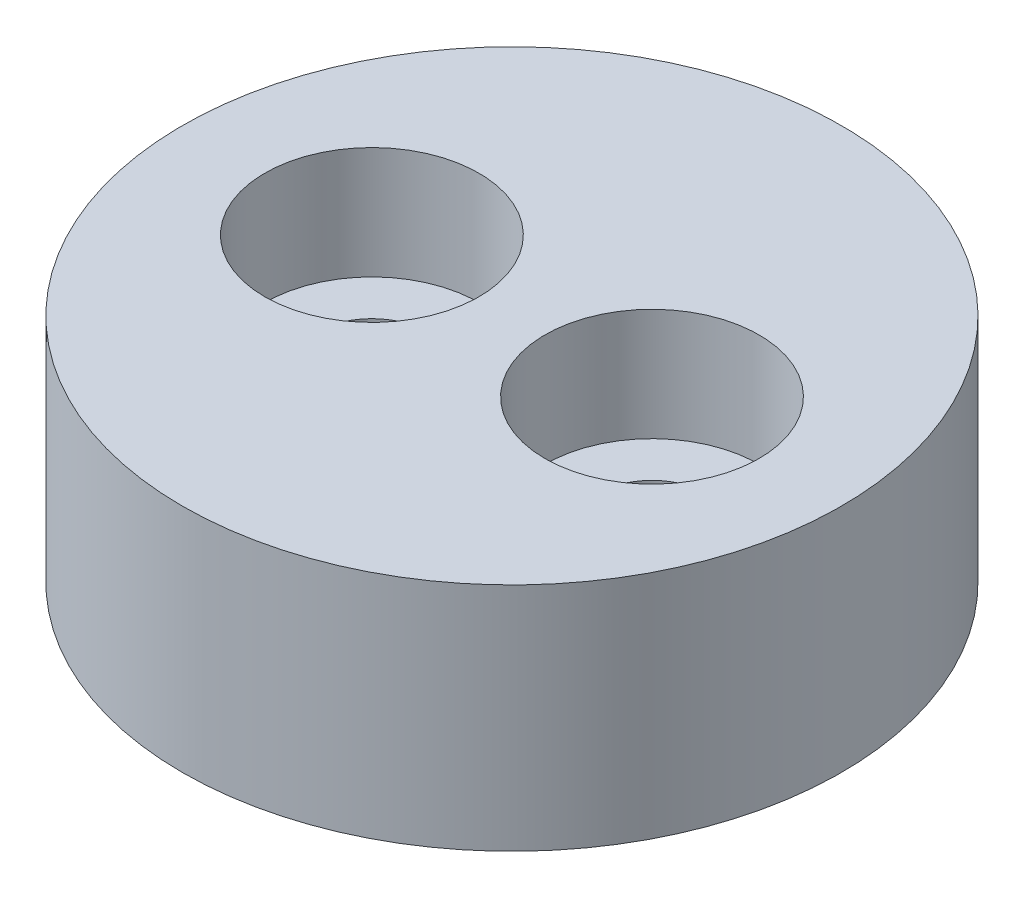
ISO-10303-21;
HEADER;
FILE_DESCRIPTION(('STEP AP214'),'2;1');
FILE_NAME('part.step','',(''),(''),'','','');
FILE_SCHEMA(('AUTOMOTIVE_DESIGN { 1 0 10303 214 1 1 1 1 }'));
ENDSEC;
DATA;
#1=APPLICATION_CONTEXT('core data for automotive mechanical design processes');
#2=APPLICATION_PROTOCOL_DEFINITION('international standard','automotive_design',2000,#1);
#3=PRODUCT_CONTEXT('',#1,'mechanical');
#4=PRODUCT('Part','Part','',(#3));
#5=PRODUCT_RELATED_PRODUCT_CATEGORY('part','',(#4));
#6=PRODUCT_DEFINITION_FORMATION('','',#4);
#7=PRODUCT_DEFINITION_CONTEXT('part definition',#1,'design');
#8=PRODUCT_DEFINITION('design','',#6,#7);
#9=PRODUCT_DEFINITION_SHAPE('','',#8);
#10=(LENGTH_UNIT() NAMED_UNIT(*) SI_UNIT(.MILLI.,.METRE.));
#11=(NAMED_UNIT(*) PLANE_ANGLE_UNIT() SI_UNIT($,.RADIAN.));
#12=(NAMED_UNIT(*) SI_UNIT($,.STERADIAN.) SOLID_ANGLE_UNIT());
#13=UNCERTAINTY_MEASURE_WITH_UNIT(LENGTH_MEASURE(1.E-05),#10,'distance_accuracy_value','');
#14=(GEOMETRIC_REPRESENTATION_CONTEXT(3) GLOBAL_UNCERTAINTY_ASSIGNED_CONTEXT((#13)) GLOBAL_UNIT_ASSIGNED_CONTEXT((#10,
#11,#12)) REPRESENTATION_CONTEXT('',''));
#15=CARTESIAN_POINT('',(0.,0.,0.));
#16=DIRECTION('',(0.,0.,1.));
#17=DIRECTION('',(1.,0.,0.));
#18=AXIS2_PLACEMENT_3D('',#15,#16,#17);
#19=CARTESIAN_POINT('',(0.,7.,0.));
#20=DIRECTION('',(0.,-1.,0.));
#21=DIRECTION('',(0.,0.,-1.));
#22=AXIS2_PLACEMENT_3D('',#19,#20,#21);
#23=CYLINDRICAL_SURFACE('',#22,10.);
#24=CARTESIAN_POINT('',(0.,7.,0.));
#25=DIRECTION('',(0.,1.,0.));
#26=DIRECTION('',(0.,0.,1.));
#27=AXIS2_PLACEMENT_3D('',#24,#25,#26);
#28=CIRCLE('',#27,10.);
#29=CARTESIAN_POINT('',(0.,7.,10.));
#30=VERTEX_POINT('',#29);
#31=EDGE_CURVE('E10',#30,#30,#28,.T.);
#32=ORIENTED_EDGE('',*,*,#31,.F.);
#33=EDGE_LOOP('',(#32));
#34=FACE_BOUND('',#33,.T.);
#35=CARTESIAN_POINT('',(0.,0.,0.));
#36=DIRECTION('',(0.,1.,0.));
#37=DIRECTION('',(0.,0.,1.));
#38=AXIS2_PLACEMENT_3D('',#35,#36,#37);
#39=CIRCLE('',#38,10.);
#40=CARTESIAN_POINT('',(0.,0.,10.));
#41=VERTEX_POINT('',#40);
#42=EDGE_CURVE('E45',#41,#41,#39,.T.);
#43=ORIENTED_EDGE('',*,*,#42,.T.);
#44=EDGE_LOOP('',(#43));
#45=FACE_BOUND('',#44,.T.);
#46=ADVANCED_FACE('F39',(#34,#45),#23,.T.);
#47=CARTESIAN_POINT('',(0.,7.,0.));
#48=DIRECTION('',(0.,1.,0.));
#49=DIRECTION('',(0.,0.,1.));
#50=AXIS2_PLACEMENT_3D('',#47,#48,#49);
#51=PLANE('',#50);
#52=CARTESIAN_POINT('',(-4.25,7.,0.));
#53=DIRECTION('',(0.,1.,0.));
#54=DIRECTION('',(0.,0.,1.));
#55=AXIS2_PLACEMENT_3D('',#52,#53,#54);
#56=CIRCLE('',#55,3.25);
#57=CARTESIAN_POINT('',(-4.25,7.,3.25));
#58=VERTEX_POINT('',#57);
#59=EDGE_CURVE('E72',#58,#58,#56,.T.);
#60=ORIENTED_EDGE('',*,*,#59,.F.);
#61=EDGE_LOOP('',(#60));
#62=FACE_BOUND('',#61,.T.);
#63=CARTESIAN_POINT('',(4.25,7.,0.));
#64=DIRECTION('',(0.,1.,0.));
#65=DIRECTION('',(0.,0.,1.));
#66=AXIS2_PLACEMENT_3D('',#63,#64,#65);
#67=CIRCLE('',#66,3.25);
#68=CARTESIAN_POINT('',(4.25,7.,3.25));
#69=VERTEX_POINT('',#68);
#70=EDGE_CURVE('E56',#69,#69,#67,.T.);
#71=ORIENTED_EDGE('',*,*,#70,.F.);
#72=EDGE_LOOP('',(#71));
#73=FACE_BOUND('',#72,.T.);
#74=ORIENTED_EDGE('',*,*,#31,.T.);
#75=EDGE_LOOP('',(#74));
#76=FACE_BOUND('',#75,.T.);
#77=ADVANCED_FACE('F77',(#62,#73,#76),#51,.T.);
#78=CARTESIAN_POINT('',(0.,0.,0.));
#79=DIRECTION('',(0.,1.,0.));
#80=DIRECTION('',(0.,0.,1.));
#81=AXIS2_PLACEMENT_3D('',#78,#79,#80);
#82=PLANE('',#81);
#83=CARTESIAN_POINT('',(-4.25,0.,0.));
#84=DIRECTION('',(0.,1.,0.));
#85=DIRECTION('',(0.,0.,1.));
#86=AXIS2_PLACEMENT_3D('',#83,#84,#85);
#87=CIRCLE('',#86,1.7);
#88=CARTESIAN_POINT('',(-4.25,0.,1.7));
#89=VERTEX_POINT('',#88);
#90=EDGE_CURVE('E62',#89,#89,#87,.T.);
#91=ORIENTED_EDGE('',*,*,#90,.T.);
#92=EDGE_LOOP('',(#91));
#93=FACE_BOUND('',#92,.T.);
#94=CARTESIAN_POINT('',(4.25,0.,0.));
#95=DIRECTION('',(0.,1.,0.));
#96=DIRECTION('',(0.,0.,1.));
#97=AXIS2_PLACEMENT_3D('',#94,#95,#96);
#98=CIRCLE('',#97,1.7);
#99=CARTESIAN_POINT('',(4.25,0.,1.7));
#100=VERTEX_POINT('',#99);
#101=EDGE_CURVE('E47',#100,#100,#98,.T.);
#102=ORIENTED_EDGE('',*,*,#101,.T.);
#103=EDGE_LOOP('',(#102));
#104=FACE_BOUND('',#103,.T.);
#105=ORIENTED_EDGE('',*,*,#42,.F.);
#106=EDGE_LOOP('',(#105));
#107=FACE_BOUND('',#106,.T.);
#108=ADVANCED_FACE('F80',(#93,#104,#107),#82,.F.);
#109=CARTESIAN_POINT('',(4.25,7.,0.));
#110=DIRECTION('',(0.,1.,0.));
#111=DIRECTION('',(0.,0.,1.));
#112=AXIS2_PLACEMENT_3D('',#109,#110,#111);
#113=CYLINDRICAL_SURFACE('',#112,1.7);
#114=ORIENTED_EDGE('',*,*,#101,.F.);
#115=EDGE_LOOP('',(#114));
#116=FACE_BOUND('',#115,.T.);
#117=CARTESIAN_POINT('',(4.25,3.6,0.));
#118=DIRECTION('',(0.,1.,0.));
#119=DIRECTION('',(0.,0.,1.));
#120=AXIS2_PLACEMENT_3D('',#117,#118,#119);
#121=CIRCLE('',#120,1.7);
#122=CARTESIAN_POINT('',(4.25,3.6,1.7));
#123=VERTEX_POINT('',#122);
#124=EDGE_CURVE('E52',#123,#123,#121,.T.);
#125=ORIENTED_EDGE('',*,*,#124,.T.);
#126=EDGE_LOOP('',(#125));
#127=FACE_BOUND('',#126,.T.);
#128=ADVANCED_FACE('F100',(#116,#127),#113,.F.);
#129=CARTESIAN_POINT('',(5.95,3.6,0.));
#130=DIRECTION('',(0.,-1.,0.));
#131=DIRECTION('',(0.,0.,-1.));
#132=AXIS2_PLACEMENT_3D('',#129,#130,#131);
#133=PLANE('',#132);
#134=ORIENTED_EDGE('',*,*,#124,.F.);
#135=EDGE_LOOP('',(#134));
#136=FACE_BOUND('',#135,.T.);
#137=CARTESIAN_POINT('',(4.25,3.6,0.));
#138=DIRECTION('',(0.,1.,0.));
#139=DIRECTION('',(0.,0.,1.));
#140=AXIS2_PLACEMENT_3D('',#137,#138,#139);
#141=CIRCLE('',#140,3.25);
#142=CARTESIAN_POINT('',(4.25,3.6,3.25));
#143=VERTEX_POINT('',#142);
#144=EDGE_CURVE('E57',#143,#143,#141,.T.);
#145=ORIENTED_EDGE('',*,*,#144,.T.);
#146=EDGE_LOOP('',(#145));
#147=FACE_BOUND('',#146,.T.);
#148=ADVANCED_FACE('F87',(#136,#147),#133,.F.);
#149=CARTESIAN_POINT('',(4.25,7.,0.));
#150=DIRECTION('',(0.,1.,0.));
#151=DIRECTION('',(0.,0.,1.));
#152=AXIS2_PLACEMENT_3D('',#149,#150,#151);
#153=CYLINDRICAL_SURFACE('',#152,3.25);
#154=ORIENTED_EDGE('',*,*,#144,.F.);
#155=EDGE_LOOP('',(#154));
#156=FACE_BOUND('',#155,.T.);
#157=ORIENTED_EDGE('',*,*,#70,.T.);
#158=EDGE_LOOP('',(#157));
#159=FACE_BOUND('',#158,.T.);
#160=ADVANCED_FACE('F83',(#156,#159),#153,.F.);
#161=CARTESIAN_POINT('',(-4.25,7.,0.));
#162=DIRECTION('',(0.,1.,0.));
#163=DIRECTION('',(0.,0.,1.));
#164=AXIS2_PLACEMENT_3D('',#161,#162,#163);
#165=CYLINDRICAL_SURFACE('',#164,1.7);
#166=ORIENTED_EDGE('',*,*,#90,.F.);
#167=EDGE_LOOP('',(#166));
#168=FACE_BOUND('',#167,.T.);
#169=CARTESIAN_POINT('',(-4.25,3.6,0.));
#170=DIRECTION('',(0.,1.,0.));
#171=DIRECTION('',(0.,0.,1.));
#172=AXIS2_PLACEMENT_3D('',#169,#170,#171);
#173=CIRCLE('',#172,1.7);
#174=CARTESIAN_POINT('',(-4.25,3.6,1.7));
#175=VERTEX_POINT('',#174);
#176=EDGE_CURVE('E65',#175,#175,#173,.T.);
#177=ORIENTED_EDGE('',*,*,#176,.T.);
#178=EDGE_LOOP('',(#177));
#179=FACE_BOUND('',#178,.T.);
#180=ADVANCED_FACE('F88',(#168,#179),#165,.F.);
#181=CARTESIAN_POINT('',(-2.55,3.6,0.));
#182=DIRECTION('',(0.,-1.,0.));
#183=DIRECTION('',(0.,0.,-1.));
#184=AXIS2_PLACEMENT_3D('',#181,#182,#183);
#185=PLANE('',#184);
#186=ORIENTED_EDGE('',*,*,#176,.F.);
#187=EDGE_LOOP('',(#186));
#188=FACE_BOUND('',#187,.T.);
#189=CARTESIAN_POINT('',(-4.25,3.6,0.));
#190=DIRECTION('',(0.,1.,0.));
#191=DIRECTION('',(0.,0.,1.));
#192=AXIS2_PLACEMENT_3D('',#189,#190,#191);
#193=CIRCLE('',#192,3.25);
#194=CARTESIAN_POINT('',(-4.25,3.6,3.25));
#195=VERTEX_POINT('',#194);
#196=EDGE_CURVE('E67',#195,#195,#193,.T.);
#197=ORIENTED_EDGE('',*,*,#196,.T.);
#198=EDGE_LOOP('',(#197));
#199=FACE_BOUND('',#198,.T.);
#200=ADVANCED_FACE('F94',(#188,#199),#185,.F.);
#201=CARTESIAN_POINT('',(-4.25,7.,0.));
#202=DIRECTION('',(0.,1.,0.));
#203=DIRECTION('',(0.,0.,1.));
#204=AXIS2_PLACEMENT_3D('',#201,#202,#203);
#205=CYLINDRICAL_SURFACE('',#204,3.25);
#206=ORIENTED_EDGE('',*,*,#196,.F.);
#207=EDGE_LOOP('',(#206));
#208=FACE_BOUND('',#207,.T.);
#209=ORIENTED_EDGE('',*,*,#59,.T.);
#210=EDGE_LOOP('',(#209));
#211=FACE_BOUND('',#210,.T.);
#212=ADVANCED_FACE('F73',(#208,#211),#205,.F.);
#213=CLOSED_SHELL('',(#46,#77,#108,#128,#148,#160,#180,#200,#212));
#214=MANIFOLD_SOLID_BREP('B2',#213);
#215=ADVANCED_BREP_SHAPE_REPRESENTATION('',(#18,#214),#14);
#216=SHAPE_DEFINITION_REPRESENTATION(#9,#215);
ENDSEC;
END-ISO-10303-21;
